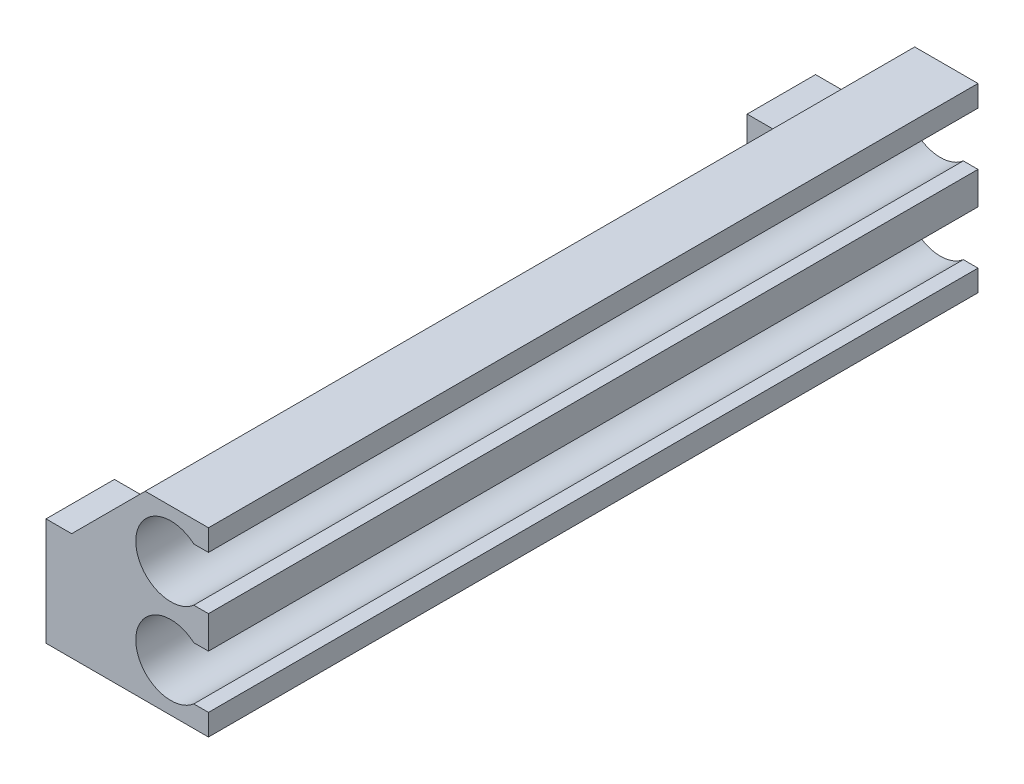
ISO-10303-21;
HEADER;
FILE_DESCRIPTION(('STEP AP214'),'2;1');
FILE_NAME('part.step','',(''),(''),'','','');
FILE_SCHEMA(('AUTOMOTIVE_DESIGN { 1 0 10303 214 1 1 1 1 }'));
ENDSEC;
DATA;
#1=APPLICATION_CONTEXT('core data for automotive mechanical design processes');
#2=APPLICATION_PROTOCOL_DEFINITION('international standard','automotive_design',2000,#1);
#3=PRODUCT_CONTEXT('',#1,'mechanical');
#4=PRODUCT('Part','Part','',(#3));
#5=PRODUCT_RELATED_PRODUCT_CATEGORY('part','',(#4));
#6=PRODUCT_DEFINITION_FORMATION('','',#4);
#7=PRODUCT_DEFINITION_CONTEXT('part definition',#1,'design');
#8=PRODUCT_DEFINITION('design','',#6,#7);
#9=PRODUCT_DEFINITION_SHAPE('','',#8);
#10=(LENGTH_UNIT() NAMED_UNIT(*) SI_UNIT(.MILLI.,.METRE.));
#11=(NAMED_UNIT(*) PLANE_ANGLE_UNIT() SI_UNIT($,.RADIAN.));
#12=(NAMED_UNIT(*) SI_UNIT($,.STERADIAN.) SOLID_ANGLE_UNIT());
#13=UNCERTAINTY_MEASURE_WITH_UNIT(LENGTH_MEASURE(1.E-05),#10,'distance_accuracy_value','');
#14=(GEOMETRIC_REPRESENTATION_CONTEXT(3) GLOBAL_UNCERTAINTY_ASSIGNED_CONTEXT((#13)) GLOBAL_UNIT_ASSIGNED_CONTEXT((#10,
#11,#12)) REPRESENTATION_CONTEXT('',''));
#15=CARTESIAN_POINT('',(0.,0.,0.));
#16=DIRECTION('',(0.,0.,1.));
#17=DIRECTION('',(1.,0.,0.));
#18=AXIS2_PLACEMENT_3D('',#15,#16,#17);
#19=CARTESIAN_POINT('',(1.50000000000002,6.3,45.));
#20=DIRECTION('',(0.,-1.,0.));
#21=DIRECTION('',(0.,0.,-1.));
#22=AXIS2_PLACEMENT_3D('',#19,#20,#21);
#23=PLANE('',#22);
#24=DIRECTION('',(-1.,0.,0.));
#25=VECTOR('',#24,1.);
#26=CARTESIAN_POINT('',(0.,6.3,4.));
#27=LINE('',#26,#25);
#28=CARTESIAN_POINT('',(0.,6.3,4.00000000000001));
#29=VERTEX_POINT('',#28);
#30=CARTESIAN_POINT('',(1.50000000000002,6.3,4.00000000000001));
#31=VERTEX_POINT('',#30);
#32=EDGE_CURVE('E94',#29,#31,#27,.F.);
#33=ORIENTED_EDGE('',*,*,#32,.T.);
#34=DIRECTION('',(0.,0.,1.));
#35=VECTOR('',#34,1.);
#36=CARTESIAN_POINT('',(1.50000000000002,6.3,45.));
#37=LINE('',#36,#35);
#38=CARTESIAN_POINT('',(1.50000000000002,6.3,0.));
#39=VERTEX_POINT('',#38);
#40=EDGE_CURVE('E262',#31,#39,#37,.F.);
#41=ORIENTED_EDGE('',*,*,#40,.T.);
#42=DIRECTION('',(1.,0.,0.));
#43=VECTOR('',#42,1.);
#44=CARTESIAN_POINT('',(1.50000000000002,6.3,0.));
#45=LINE('',#44,#43);
#46=CARTESIAN_POINT('',(0.,6.3,0.));
#47=VERTEX_POINT('',#46);
#48=EDGE_CURVE('E322',#47,#39,#45,.T.);
#49=ORIENTED_EDGE('',*,*,#48,.F.);
#50=DIRECTION('',(0.,0.,1.));
#51=VECTOR('',#50,1.);
#52=CARTESIAN_POINT('',(0.,6.3,45.));
#53=LINE('',#52,#51);
#54=EDGE_CURVE('E288',#47,#29,#53,.T.);
#55=ORIENTED_EDGE('',*,*,#54,.T.);
#56=EDGE_LOOP('',(#33,#41,#49,#55));
#57=FACE_BOUND('',#56,.T.);
#58=ADVANCED_FACE('F16',(#57),#23,.F.);
#59=CARTESIAN_POINT('',(1.50000000000002,6.3,45.));
#60=DIRECTION('',(0.,-1.,0.));
#61=DIRECTION('',(0.,0.,-1.));
#62=AXIS2_PLACEMENT_3D('',#59,#60,#61);
#63=PLANE('',#62);
#64=DIRECTION('',(1.,0.,0.));
#65=VECTOR('',#64,1.);
#66=CARTESIAN_POINT('',(0.,6.3,41.));
#67=LINE('',#66,#65);
#68=CARTESIAN_POINT('',(1.50000000000002,6.3,41.));
#69=VERTEX_POINT('',#68);
#70=CARTESIAN_POINT('',(0.,6.3,41.));
#71=VERTEX_POINT('',#70);
#72=EDGE_CURVE('E315',#69,#71,#67,.F.);
#73=ORIENTED_EDGE('',*,*,#72,.T.);
#74=DIRECTION('',(0.,0.,1.));
#75=VECTOR('',#74,1.);
#76=CARTESIAN_POINT('',(0.,6.3,45.));
#77=LINE('',#76,#75);
#78=CARTESIAN_POINT('',(0.,6.3,45.));
#79=VERTEX_POINT('',#78);
#80=EDGE_CURVE('E182',#71,#79,#77,.T.);
#81=ORIENTED_EDGE('',*,*,#80,.T.);
#82=DIRECTION('',(1.,0.,0.));
#83=VECTOR('',#82,1.);
#84=CARTESIAN_POINT('',(1.50000000000002,6.3,45.));
#85=LINE('',#84,#83);
#86=CARTESIAN_POINT('',(1.50000000000002,6.3,45.));
#87=VERTEX_POINT('',#86);
#88=EDGE_CURVE('E172',#87,#79,#85,.F.);
#89=ORIENTED_EDGE('',*,*,#88,.F.);
#90=DIRECTION('',(0.,0.,1.));
#91=VECTOR('',#90,1.);
#92=CARTESIAN_POINT('',(1.50000000000002,6.3,45.));
#93=LINE('',#92,#91);
#94=EDGE_CURVE('E256',#87,#69,#93,.F.);
#95=ORIENTED_EDGE('',*,*,#94,.T.);
#96=EDGE_LOOP('',(#73,#81,#89,#95));
#97=FACE_BOUND('',#96,.T.);
#98=ADVANCED_FACE('F381',(#97),#63,.F.);
#99=CARTESIAN_POINT('',(9.5,0.,45.));
#100=DIRECTION('',(-1.,0.,0.));
#101=DIRECTION('',(0.,0.,1.));
#102=AXIS2_PLACEMENT_3D('',#99,#100,#101);
#103=PLANE('',#102);
#104=DIRECTION('',(0.,0.,1.));
#105=VECTOR('',#104,1.);
#106=CARTESIAN_POINT('',(9.5,1.25,0.));
#107=LINE('',#106,#105);
#108=CARTESIAN_POINT('',(9.5,1.25,0.));
#109=VERTEX_POINT('',#108);
#110=CARTESIAN_POINT('',(9.5,1.25,45.));
#111=VERTEX_POINT('',#110);
#112=EDGE_CURVE('E171',#109,#111,#107,.T.);
#113=ORIENTED_EDGE('',*,*,#112,.T.);
#114=DIRECTION('',(0.,1.,0.));
#115=VECTOR('',#114,1.);
#116=CARTESIAN_POINT('',(9.5,0.,45.));
#117=LINE('',#116,#115);
#118=CARTESIAN_POINT('',(9.5,0.,45.));
#119=VERTEX_POINT('',#118);
#120=EDGE_CURVE('E85',#119,#111,#117,.T.);
#121=ORIENTED_EDGE('',*,*,#120,.F.);
#122=DIRECTION('',(0.,0.,1.));
#123=VECTOR('',#122,1.);
#124=CARTESIAN_POINT('',(9.5,0.,45.));
#125=LINE('',#124,#123);
#126=CARTESIAN_POINT('',(9.5,0.,0.));
#127=VERTEX_POINT('',#126);
#128=EDGE_CURVE('E169',#119,#127,#125,.F.);
#129=ORIENTED_EDGE('',*,*,#128,.T.);
#130=DIRECTION('',(0.,1.,0.));
#131=VECTOR('',#130,1.);
#132=CARTESIAN_POINT('',(9.5,0.,0.));
#133=LINE('',#132,#131);
#134=EDGE_CURVE('E71',#109,#127,#133,.F.);
#135=ORIENTED_EDGE('',*,*,#134,.F.);
#136=EDGE_LOOP('',(#113,#121,#129,#135));
#137=FACE_BOUND('',#136,.T.);
#138=ADVANCED_FACE('F168',(#137),#103,.F.);
#139=CARTESIAN_POINT('',(0.,10.6,4.));
#140=DIRECTION('',(0.,0.,-1.));
#141=DIRECTION('',(-1.,0.,0.));
#142=AXIS2_PLACEMENT_3D('',#139,#140,#141);
#143=PLANE('',#142);
#144=DIRECTION('',(0.,1.,0.));
#145=VECTOR('',#144,1.);
#146=CARTESIAN_POINT('',(0.,6.3,4.));
#147=LINE('',#146,#145);
#148=CARTESIAN_POINT('',(0.,0.,4.));
#149=VERTEX_POINT('',#148);
#150=EDGE_CURVE('E280',#29,#149,#147,.F.);
#151=ORIENTED_EDGE('',*,*,#150,.T.);
#152=DIRECTION('',(1.,0.,0.));
#153=VECTOR('',#152,1.);
#154=CARTESIAN_POINT('',(0.,0.,4.));
#155=LINE('',#154,#153);
#156=CARTESIAN_POINT('',(4.3,0.,4.));
#157=VERTEX_POINT('',#156);
#158=EDGE_CURVE('E240',#149,#157,#155,.T.);
#159=ORIENTED_EDGE('',*,*,#158,.T.);
#160=DIRECTION('',(0.,1.,0.));
#161=VECTOR('',#160,1.);
#162=CARTESIAN_POINT('',(4.3,10.6,4.));
#163=LINE('',#162,#161);
#164=CARTESIAN_POINT('',(4.3,9.1,4.));
#165=VERTEX_POINT('',#164);
#166=EDGE_CURVE('E317',#157,#165,#163,.T.);
#167=ORIENTED_EDGE('',*,*,#166,.T.);
#168=DIRECTION('',(0.707106781186546,0.707106781186549,0.));
#169=VECTOR('',#168,1.);
#170=CARTESIAN_POINT('',(5.8,10.6,4.));
#171=LINE('',#170,#169);
#172=EDGE_CURVE('E265',#165,#31,#171,.F.);
#173=ORIENTED_EDGE('',*,*,#172,.T.);
#174=ORIENTED_EDGE('',*,*,#32,.F.);
#175=EDGE_LOOP('',(#151,#159,#167,#173,#174));
#176=FACE_BOUND('',#175,.T.);
#177=ADVANCED_FACE('F391',(#176),#143,.F.);
#178=CARTESIAN_POINT('',(4.3,10.6,41.));
#179=DIRECTION('',(1.,0.,0.));
#180=DIRECTION('',(0.,0.,-1.));
#181=AXIS2_PLACEMENT_3D('',#178,#179,#180);
#182=PLANE('',#181);
#183=DIRECTION('',(0.,0.,1.));
#184=VECTOR('',#183,1.);
#185=CARTESIAN_POINT('',(4.3,0.,45.));
#186=LINE('',#185,#184);
#187=CARTESIAN_POINT('',(4.3,0.,41.));
#188=VERTEX_POINT('',#187);
#189=EDGE_CURVE('E237',#157,#188,#186,.T.);
#190=ORIENTED_EDGE('',*,*,#189,.T.);
#191=DIRECTION('',(0.,1.,0.));
#192=VECTOR('',#191,1.);
#193=CARTESIAN_POINT('',(4.3,10.6,41.));
#194=LINE('',#193,#192);
#195=CARTESIAN_POINT('',(4.3,9.1,41.));
#196=VERTEX_POINT('',#195);
#197=EDGE_CURVE('E311',#188,#196,#194,.T.);
#198=ORIENTED_EDGE('',*,*,#197,.T.);
#199=DIRECTION('',(0.,0.,1.));
#200=VECTOR('',#199,1.);
#201=CARTESIAN_POINT('',(4.3,9.1,45.));
#202=LINE('',#201,#200);
#203=EDGE_CURVE('E250',#196,#165,#202,.F.);
#204=ORIENTED_EDGE('',*,*,#203,.T.);
#205=ORIENTED_EDGE('',*,*,#166,.F.);
#206=EDGE_LOOP('',(#190,#198,#204,#205));
#207=FACE_BOUND('',#206,.T.);
#208=ADVANCED_FACE('F389',(#207),#182,.F.);
#209=CARTESIAN_POINT('',(0.,10.6,41.));
#210=DIRECTION('',(0.,0.,1.));
#211=DIRECTION('',(1.,0.,0.));
#212=AXIS2_PLACEMENT_3D('',#209,#210,#211);
#213=PLANE('',#212);
#214=DIRECTION('',(1.,0.,0.));
#215=VECTOR('',#214,1.);
#216=CARTESIAN_POINT('',(0.,0.,41.));
#217=LINE('',#216,#215);
#218=CARTESIAN_POINT('',(0.,0.,41.));
#219=VERTEX_POINT('',#218);
#220=EDGE_CURVE('E234',#188,#219,#217,.F.);
#221=ORIENTED_EDGE('',*,*,#220,.T.);
#222=DIRECTION('',(0.,1.,0.));
#223=VECTOR('',#222,1.);
#224=CARTESIAN_POINT('',(0.,6.3,41.));
#225=LINE('',#224,#223);
#226=EDGE_CURVE('E247',#219,#71,#225,.T.);
#227=ORIENTED_EDGE('',*,*,#226,.T.);
#228=ORIENTED_EDGE('',*,*,#72,.F.);
#229=DIRECTION('',(0.707106781186546,0.707106781186549,0.));
#230=VECTOR('',#229,1.);
#231=CARTESIAN_POINT('',(5.8,10.6,41.));
#232=LINE('',#231,#230);
#233=EDGE_CURVE('E253',#69,#196,#232,.T.);
#234=ORIENTED_EDGE('',*,*,#233,.T.);
#235=ORIENTED_EDGE('',*,*,#197,.F.);
#236=EDGE_LOOP('',(#221,#227,#228,#234,#235));
#237=FACE_BOUND('',#236,.T.);
#238=ADVANCED_FACE('F387',(#237),#213,.F.);
#239=CARTESIAN_POINT('',(8.64164078649987,4.35,0.));
#240=DIRECTION('',(0.,1.,0.));
#241=DIRECTION('',(-1.,0.,0.));
#242=AXIS2_PLACEMENT_3D('',#239,#240,#241);
#243=PLANE('',#242);
#244=DIRECTION('',(0.,0.,1.));
#245=VECTOR('',#244,1.);
#246=CARTESIAN_POINT('',(8.64164078649987,4.35,0.));
#247=LINE('',#246,#245);
#248=CARTESIAN_POINT('',(8.64164078649987,4.35,45.));
#249=VERTEX_POINT('',#248);
#250=CARTESIAN_POINT('',(8.64164078649987,4.35,0.));
#251=VERTEX_POINT('',#250);
#252=EDGE_CURVE('E229',#249,#251,#247,.F.);
#253=ORIENTED_EDGE('',*,*,#252,.T.);
#254=DIRECTION('',(-1.,0.,0.));
#255=VECTOR('',#254,1.);
#256=CARTESIAN_POINT('',(8.64164078649987,4.35,0.));
#257=LINE('',#256,#255);
#258=CARTESIAN_POINT('',(9.5,4.35,0.));
#259=VERTEX_POINT('',#258);
#260=EDGE_CURVE('E307',#259,#251,#257,.T.);
#261=ORIENTED_EDGE('',*,*,#260,.F.);
#262=DIRECTION('',(0.,0.,1.));
#263=VECTOR('',#262,1.);
#264=CARTESIAN_POINT('',(9.5,4.35,45.));
#265=LINE('',#264,#263);
#266=CARTESIAN_POINT('',(9.5,4.35,45.));
#267=VERTEX_POINT('',#266);
#268=EDGE_CURVE('E278',#259,#267,#265,.T.);
#269=ORIENTED_EDGE('',*,*,#268,.T.);
#270=DIRECTION('',(-1.,0.,0.));
#271=VECTOR('',#270,1.);
#272=CARTESIAN_POINT('',(8.64164078649987,4.35,45.));
#273=LINE('',#272,#271);
#274=EDGE_CURVE('E119',#249,#267,#273,.F.);
#275=ORIENTED_EDGE('',*,*,#274,.F.);
#276=EDGE_LOOP('',(#253,#261,#269,#275));
#277=FACE_BOUND('',#276,.T.);
#278=ADVANCED_FACE('F357',(#277),#243,.F.);
#279=CARTESIAN_POINT('',(9.5,1.25,0.));
#280=DIRECTION('',(0.,-1.,0.));
#281=DIRECTION('',(1.,0.,0.));
#282=AXIS2_PLACEMENT_3D('',#279,#280,#281);
#283=PLANE('',#282);
#284=ORIENTED_EDGE('',*,*,#112,.F.);
#285=DIRECTION('',(1.,0.,0.));
#286=VECTOR('',#285,1.);
#287=CARTESIAN_POINT('',(9.5,1.25,0.));
#288=LINE('',#287,#286);
#289=CARTESIAN_POINT('',(8.64164078649987,1.25,0.));
#290=VERTEX_POINT('',#289);
#291=EDGE_CURVE('E61',#290,#109,#288,.T.);
#292=ORIENTED_EDGE('',*,*,#291,.F.);
#293=DIRECTION('',(0.,0.,1.));
#294=VECTOR('',#293,1.);
#295=CARTESIAN_POINT('',(8.64164078649987,1.25,0.));
#296=LINE('',#295,#294);
#297=CARTESIAN_POINT('',(8.64164078649987,1.25,45.));
#298=VERTEX_POINT('',#297);
#299=EDGE_CURVE('E227',#290,#298,#296,.T.);
#300=ORIENTED_EDGE('',*,*,#299,.T.);
#301=DIRECTION('',(1.,0.,0.));
#302=VECTOR('',#301,1.);
#303=CARTESIAN_POINT('',(9.5,1.25,45.));
#304=LINE('',#303,#302);
#305=EDGE_CURVE('E297',#111,#298,#304,.F.);
#306=ORIENTED_EDGE('',*,*,#305,.F.);
#307=EDGE_LOOP('',(#284,#292,#300,#306));
#308=FACE_BOUND('',#307,.T.);
#309=ADVANCED_FACE('F439',(#308),#283,.F.);
#310=CARTESIAN_POINT('',(9.5,0.,45.));
#311=DIRECTION('',(-1.,0.,0.));
#312=DIRECTION('',(0.,0.,1.));
#313=AXIS2_PLACEMENT_3D('',#310,#311,#312);
#314=PLANE('',#313);
#315=DIRECTION('',(0.,0.,1.));
#316=VECTOR('',#315,1.);
#317=CARTESIAN_POINT('',(9.5,9.35,0.));
#318=LINE('',#317,#316);
#319=CARTESIAN_POINT('',(9.5,9.35,45.));
#320=VERTEX_POINT('',#319);
#321=CARTESIAN_POINT('',(9.5,9.35,0.));
#322=VERTEX_POINT('',#321);
#323=EDGE_CURVE('E224',#320,#322,#318,.F.);
#324=ORIENTED_EDGE('',*,*,#323,.T.);
#325=DIRECTION('',(0.,1.,0.));
#326=VECTOR('',#325,1.);
#327=CARTESIAN_POINT('',(9.5,0.,0.));
#328=LINE('',#327,#326);
#329=CARTESIAN_POINT('',(9.5,10.6,0.));
#330=VERTEX_POINT('',#329);
#331=EDGE_CURVE('E293',#330,#322,#328,.F.);
#332=ORIENTED_EDGE('',*,*,#331,.F.);
#333=DIRECTION('',(0.,0.,-1.));
#334=VECTOR('',#333,1.);
#335=CARTESIAN_POINT('',(9.5,10.6,45.));
#336=LINE('',#335,#334);
#337=CARTESIAN_POINT('',(9.5,10.6,45.));
#338=VERTEX_POINT('',#337);
#339=EDGE_CURVE('E267',#330,#338,#336,.F.);
#340=ORIENTED_EDGE('',*,*,#339,.T.);
#341=DIRECTION('',(0.,1.,0.));
#342=VECTOR('',#341,1.);
#343=CARTESIAN_POINT('',(9.5,0.,45.));
#344=LINE('',#343,#342);
#345=EDGE_CURVE('E291',#320,#338,#344,.T.);
#346=ORIENTED_EDGE('',*,*,#345,.F.);
#347=EDGE_LOOP('',(#324,#332,#340,#346));
#348=FACE_BOUND('',#347,.T.);
#349=ADVANCED_FACE('F436',(#348),#314,.F.);
#350=CARTESIAN_POINT('',(0.,6.3,45.));
#351=DIRECTION('',(1.,0.,0.));
#352=DIRECTION('',(0.,1.,0.));
#353=AXIS2_PLACEMENT_3D('',#350,#351,#352);
#354=PLANE('',#353);
#355=ORIENTED_EDGE('',*,*,#150,.F.);
#356=ORIENTED_EDGE('',*,*,#54,.F.);
#357=DIRECTION('',(0.,1.,0.));
#358=VECTOR('',#357,1.);
#359=CARTESIAN_POINT('',(0.,0.,0.));
#360=LINE('',#359,#358);
#361=CARTESIAN_POINT('',(0.,0.,0.));
#362=VERTEX_POINT('',#361);
#363=EDGE_CURVE('E215',#47,#362,#360,.F.);
#364=ORIENTED_EDGE('',*,*,#363,.T.);
#365=DIRECTION('',(0.,0.,1.));
#366=VECTOR('',#365,1.);
#367=CARTESIAN_POINT('',(0.,0.,45.));
#368=LINE('',#367,#366);
#369=EDGE_CURVE('E181',#362,#149,#368,.T.);
#370=ORIENTED_EDGE('',*,*,#369,.T.);
#371=EDGE_LOOP('',(#355,#356,#364,#370));
#372=FACE_BOUND('',#371,.T.);
#373=ADVANCED_FACE('F394',(#372),#354,.F.);
#374=CARTESIAN_POINT('',(9.5,0.,45.));
#375=DIRECTION('',(-1.,0.,0.));
#376=DIRECTION('',(0.,0.,1.));
#377=AXIS2_PLACEMENT_3D('',#374,#375,#376);
#378=PLANE('',#377);
#379=ORIENTED_EDGE('',*,*,#268,.F.);
#380=DIRECTION('',(0.,1.,0.));
#381=VECTOR('',#380,1.);
#382=CARTESIAN_POINT('',(9.5,0.,0.));
#383=LINE('',#382,#381);
#384=CARTESIAN_POINT('',(9.5,6.25,0.));
#385=VERTEX_POINT('',#384);
#386=EDGE_CURVE('E212',#259,#385,#383,.T.);
#387=ORIENTED_EDGE('',*,*,#386,.T.);
#388=DIRECTION('',(0.,0.,-1.));
#389=VECTOR('',#388,1.);
#390=CARTESIAN_POINT('',(9.5,6.25,0.));
#391=LINE('',#390,#389);
#392=CARTESIAN_POINT('',(9.5,6.25,45.));
#393=VERTEX_POINT('',#392);
#394=EDGE_CURVE('E211',#385,#393,#391,.F.);
#395=ORIENTED_EDGE('',*,*,#394,.T.);
#396=DIRECTION('',(0.,1.,0.));
#397=VECTOR('',#396,1.);
#398=CARTESIAN_POINT('',(9.5,0.,45.));
#399=LINE('',#398,#397);
#400=EDGE_CURVE('E122',#267,#393,#399,.T.);
#401=ORIENTED_EDGE('',*,*,#400,.F.);
#402=EDGE_LOOP('',(#379,#387,#395,#401));
#403=FACE_BOUND('',#402,.T.);
#404=ADVANCED_FACE('F359',(#403),#378,.F.);
#405=CARTESIAN_POINT('',(9.5,10.6,45.));
#406=DIRECTION('',(0.,-1.,0.));
#407=DIRECTION('',(0.,0.,-1.));
#408=AXIS2_PLACEMENT_3D('',#405,#406,#407);
#409=PLANE('',#408);
#410=DIRECTION('',(0.,0.,1.));
#411=VECTOR('',#410,1.);
#412=CARTESIAN_POINT('',(5.8,10.6,45.));
#413=LINE('',#412,#411);
#414=CARTESIAN_POINT('',(5.8,10.6,0.));
#415=VERTEX_POINT('',#414);
#416=CARTESIAN_POINT('',(5.8,10.6,45.));
#417=VERTEX_POINT('',#416);
#418=EDGE_CURVE('E259',#415,#417,#413,.T.);
#419=ORIENTED_EDGE('',*,*,#418,.T.);
#420=DIRECTION('',(1.,0.,0.));
#421=VECTOR('',#420,1.);
#422=CARTESIAN_POINT('',(0.,10.6,45.));
#423=LINE('',#422,#421);
#424=EDGE_CURVE('E328',#338,#417,#423,.F.);
#425=ORIENTED_EDGE('',*,*,#424,.F.);
#426=ORIENTED_EDGE('',*,*,#339,.F.);
#427=DIRECTION('',(1.,0.,0.));
#428=VECTOR('',#427,1.);
#429=CARTESIAN_POINT('',(0.,10.6,0.));
#430=LINE('',#429,#428);
#431=EDGE_CURVE('E221',#330,#415,#430,.F.);
#432=ORIENTED_EDGE('',*,*,#431,.T.);
#433=EDGE_LOOP('',(#419,#425,#426,#432));
#434=FACE_BOUND('',#433,.T.);
#435=ADVANCED_FACE('F428',(#434),#409,.F.);
#436=CARTESIAN_POINT('',(5.8,10.6,45.));
#437=DIRECTION('',(0.707106781186549,-0.707106781186546,0.));
#438=DIRECTION('',(0.707106781186546,0.707106781186549,0.));
#439=AXIS2_PLACEMENT_3D('',#436,#437,#438);
#440=PLANE('',#439);
#441=ORIENTED_EDGE('',*,*,#233,.F.);
#442=ORIENTED_EDGE('',*,*,#94,.F.);
#443=DIRECTION('',(-0.707106781186546,-0.707106781186549,0.));
#444=VECTOR('',#443,1.);
#445=CARTESIAN_POINT('',(5.8,10.6,45.));
#446=LINE('',#445,#444);
#447=EDGE_CURVE('E188',#417,#87,#446,.T.);
#448=ORIENTED_EDGE('',*,*,#447,.F.);
#449=ORIENTED_EDGE('',*,*,#418,.F.);
#450=DIRECTION('',(-0.707106781186546,-0.707106781186549,0.));
#451=VECTOR('',#450,1.);
#452=CARTESIAN_POINT('',(5.8,10.6,0.));
#453=LINE('',#452,#451);
#454=EDGE_CURVE('E218',#415,#39,#453,.T.);
#455=ORIENTED_EDGE('',*,*,#454,.T.);
#456=ORIENTED_EDGE('',*,*,#40,.F.);
#457=ORIENTED_EDGE('',*,*,#172,.F.);
#458=ORIENTED_EDGE('',*,*,#203,.F.);
#459=EDGE_LOOP('',(#441,#442,#448,#449,#455,#456,#457,#458));
#460=FACE_BOUND('',#459,.T.);
#461=ADVANCED_FACE('F377',(#460),#440,.F.);
#462=CARTESIAN_POINT('',(0.,6.3,45.));
#463=DIRECTION('',(1.,0.,0.));
#464=DIRECTION('',(0.,1.,0.));
#465=AXIS2_PLACEMENT_3D('',#462,#463,#464);
#466=PLANE('',#465);
#467=ORIENTED_EDGE('',*,*,#226,.F.);
#468=DIRECTION('',(0.,0.,1.));
#469=VECTOR('',#468,1.);
#470=CARTESIAN_POINT('',(0.,0.,45.));
#471=LINE('',#470,#469);
#472=CARTESIAN_POINT('',(0.,0.,45.));
#473=VERTEX_POINT('',#472);
#474=EDGE_CURVE('E232',#219,#473,#471,.T.);
#475=ORIENTED_EDGE('',*,*,#474,.T.);
#476=DIRECTION('',(0.,1.,0.));
#477=VECTOR('',#476,1.);
#478=CARTESIAN_POINT('',(0.,0.,45.));
#479=LINE('',#478,#477);
#480=EDGE_CURVE('E163',#79,#473,#479,.F.);
#481=ORIENTED_EDGE('',*,*,#480,.F.);
#482=ORIENTED_EDGE('',*,*,#80,.F.);
#483=EDGE_LOOP('',(#467,#475,#481,#482));
#484=FACE_BOUND('',#483,.T.);
#485=ADVANCED_FACE('F384',(#484),#466,.F.);
#486=CARTESIAN_POINT('',(0.,0.,45.));
#487=DIRECTION('',(0.,1.,0.));
#488=DIRECTION('',(0.,0.,1.));
#489=AXIS2_PLACEMENT_3D('',#486,#487,#488);
#490=PLANE('',#489);
#491=ORIENTED_EDGE('',*,*,#220,.F.);
#492=ORIENTED_EDGE('',*,*,#189,.F.);
#493=ORIENTED_EDGE('',*,*,#158,.F.);
#494=ORIENTED_EDGE('',*,*,#369,.F.);
#495=DIRECTION('',(1.,0.,0.));
#496=VECTOR('',#495,1.);
#497=CARTESIAN_POINT('',(0.,0.,0.));
#498=LINE('',#497,#496);
#499=EDGE_CURVE('E180',#362,#127,#498,.T.);
#500=ORIENTED_EDGE('',*,*,#499,.T.);
#501=ORIENTED_EDGE('',*,*,#128,.F.);
#502=DIRECTION('',(1.,0.,0.));
#503=VECTOR('',#502,1.);
#504=CARTESIAN_POINT('',(0.,0.,45.));
#505=LINE('',#504,#503);
#506=EDGE_CURVE('E179',#473,#119,#505,.T.);
#507=ORIENTED_EDGE('',*,*,#506,.F.);
#508=ORIENTED_EDGE('',*,*,#474,.F.);
#509=EDGE_LOOP('',(#491,#492,#493,#494,#500,#501,#507,#508));
#510=FACE_BOUND('',#509,.T.);
#511=ADVANCED_FACE('F177',(#510),#490,.F.);
#512=CARTESIAN_POINT('',(7.3,2.8,0.));
#513=DIRECTION('',(0.,0.,1.));
#514=DIRECTION('',(1.,0.,0.));
#515=AXIS2_PLACEMENT_3D('',#512,#513,#514);
#516=CYLINDRICAL_SURFACE('',#515,2.05);
#517=ORIENTED_EDGE('',*,*,#299,.F.);
#518=CARTESIAN_POINT('',(7.3,2.8,0.));
#519=DIRECTION('',(0.,0.,1.));
#520=DIRECTION('',(1.,0.,0.));
#521=AXIS2_PLACEMENT_3D('',#518,#519,#520);
#522=CIRCLE('',#521,2.05);
#523=EDGE_CURVE('E19',#290,#251,#522,.F.);
#524=ORIENTED_EDGE('',*,*,#523,.T.);
#525=ORIENTED_EDGE('',*,*,#252,.F.);
#526=CARTESIAN_POINT('',(7.3,2.8,45.));
#527=DIRECTION('',(0.,0.,1.));
#528=DIRECTION('',(1.,0.,0.));
#529=AXIS2_PLACEMENT_3D('',#526,#527,#528);
#530=CIRCLE('',#529,2.05);
#531=EDGE_CURVE('E185',#298,#249,#530,.F.);
#532=ORIENTED_EDGE('',*,*,#531,.F.);
#533=EDGE_LOOP('',(#517,#524,#525,#532));
#534=FACE_BOUND('',#533,.T.);
#535=ADVANCED_FACE('F350',(#534),#516,.F.);
#536=CARTESIAN_POINT('',(9.5,9.35,0.));
#537=DIRECTION('',(0.,1.,0.));
#538=DIRECTION('',(-1.,0.,0.));
#539=AXIS2_PLACEMENT_3D('',#536,#537,#538);
#540=PLANE('',#539);
#541=DIRECTION('',(0.,0.,1.));
#542=VECTOR('',#541,1.);
#543=CARTESIAN_POINT('',(8.64164078649987,9.35,0.));
#544=LINE('',#543,#542);
#545=CARTESIAN_POINT('',(8.64164078649987,9.35,45.));
#546=VERTEX_POINT('',#545);
#547=CARTESIAN_POINT('',(8.64164078649987,9.35,0.));
#548=VERTEX_POINT('',#547);
#549=EDGE_CURVE('E187',#546,#548,#544,.F.);
#550=ORIENTED_EDGE('',*,*,#549,.T.);
#551=DIRECTION('',(1.,0.,0.));
#552=VECTOR('',#551,1.);
#553=CARTESIAN_POINT('',(0.,9.35,0.));
#554=LINE('',#553,#552);
#555=EDGE_CURVE('E222',#548,#322,#554,.T.);
#556=ORIENTED_EDGE('',*,*,#555,.T.);
#557=ORIENTED_EDGE('',*,*,#323,.F.);
#558=DIRECTION('',(1.,0.,0.));
#559=VECTOR('',#558,1.);
#560=CARTESIAN_POINT('',(0.,9.35,45.));
#561=LINE('',#560,#559);
#562=EDGE_CURVE('E330',#546,#320,#561,.T.);
#563=ORIENTED_EDGE('',*,*,#562,.F.);
#564=EDGE_LOOP('',(#550,#556,#557,#563));
#565=FACE_BOUND('',#564,.T.);
#566=ADVANCED_FACE('F417',(#565),#540,.F.);
#567=CARTESIAN_POINT('',(0.,0.,0.));
#568=DIRECTION('',(0.,0.,1.));
#569=DIRECTION('',(1.,0.,0.));
#570=AXIS2_PLACEMENT_3D('',#567,#568,#569);
#571=PLANE('',#570);
#572=ORIENTED_EDGE('',*,*,#260,.T.);
#573=ORIENTED_EDGE('',*,*,#523,.F.);
#574=ORIENTED_EDGE('',*,*,#291,.T.);
#575=ORIENTED_EDGE('',*,*,#134,.T.);
#576=ORIENTED_EDGE('',*,*,#499,.F.);
#577=ORIENTED_EDGE('',*,*,#363,.F.);
#578=ORIENTED_EDGE('',*,*,#48,.T.);
#579=ORIENTED_EDGE('',*,*,#454,.F.);
#580=ORIENTED_EDGE('',*,*,#431,.F.);
#581=ORIENTED_EDGE('',*,*,#331,.T.);
#582=ORIENTED_EDGE('',*,*,#555,.F.);
#583=CARTESIAN_POINT('',(7.3,7.8,0.));
#584=DIRECTION('',(0.,0.,1.));
#585=DIRECTION('',(1.,0.,0.));
#586=AXIS2_PLACEMENT_3D('',#583,#584,#585);
#587=CIRCLE('',#586,2.05);
#588=CARTESIAN_POINT('',(8.64164078649987,6.25,0.));
#589=VERTEX_POINT('',#588);
#590=EDGE_CURVE('E196',#548,#589,#587,.T.);
#591=ORIENTED_EDGE('',*,*,#590,.T.);
#592=DIRECTION('',(1.,0.,0.));
#593=VECTOR('',#592,1.);
#594=CARTESIAN_POINT('',(8.64164078649987,6.25,0.));
#595=LINE('',#594,#593);
#596=EDGE_CURVE('E209',#589,#385,#595,.T.);
#597=ORIENTED_EDGE('',*,*,#596,.T.);
#598=ORIENTED_EDGE('',*,*,#386,.F.);
#599=EDGE_LOOP('',(#572,#573,#574,#575,#576,#577,#578,#579,#580,#581,#582,#591,#597,#598));
#600=FACE_BOUND('',#599,.T.);
#601=ADVANCED_FACE('F352',(#600),#571,.F.);
#602=CARTESIAN_POINT('',(8.64164078649987,6.25,0.));
#603=DIRECTION('',(0.,-1.,0.));
#604=DIRECTION('',(0.,0.,-1.));
#605=AXIS2_PLACEMENT_3D('',#602,#603,#604);
#606=PLANE('',#605);
#607=ORIENTED_EDGE('',*,*,#394,.F.);
#608=ORIENTED_EDGE('',*,*,#596,.F.);
#609=DIRECTION('',(0.,0.,1.));
#610=VECTOR('',#609,1.);
#611=CARTESIAN_POINT('',(8.64164078649987,6.25,0.));
#612=LINE('',#611,#610);
#613=CARTESIAN_POINT('',(8.64164078649987,6.25,45.));
#614=VERTEX_POINT('',#613);
#615=EDGE_CURVE('E25',#589,#614,#612,.T.);
#616=ORIENTED_EDGE('',*,*,#615,.T.);
#617=DIRECTION('',(1.,0.,0.));
#618=VECTOR('',#617,1.);
#619=CARTESIAN_POINT('',(0.,6.25,45.));
#620=LINE('',#619,#618);
#621=EDGE_CURVE('E33',#393,#614,#620,.F.);
#622=ORIENTED_EDGE('',*,*,#621,.F.);
#623=EDGE_LOOP('',(#607,#608,#616,#622));
#624=FACE_BOUND('',#623,.T.);
#625=ADVANCED_FACE('F362',(#624),#606,.F.);
#626=CARTESIAN_POINT('',(0.,0.,45.));
#627=DIRECTION('',(0.,0.,1.));
#628=DIRECTION('',(1.,0.,0.));
#629=AXIS2_PLACEMENT_3D('',#626,#627,#628);
#630=PLANE('',#629);
#631=ORIENTED_EDGE('',*,*,#305,.T.);
#632=ORIENTED_EDGE('',*,*,#531,.T.);
#633=ORIENTED_EDGE('',*,*,#274,.T.);
#634=ORIENTED_EDGE('',*,*,#400,.T.);
#635=ORIENTED_EDGE('',*,*,#621,.T.);
#636=CARTESIAN_POINT('',(7.3,7.8,45.));
#637=DIRECTION('',(0.,0.,1.));
#638=DIRECTION('',(1.,0.,0.));
#639=AXIS2_PLACEMENT_3D('',#636,#637,#638);
#640=CIRCLE('',#639,2.05);
#641=EDGE_CURVE('E11',#614,#546,#640,.F.);
#642=ORIENTED_EDGE('',*,*,#641,.T.);
#643=ORIENTED_EDGE('',*,*,#562,.T.);
#644=ORIENTED_EDGE('',*,*,#345,.T.);
#645=ORIENTED_EDGE('',*,*,#424,.T.);
#646=ORIENTED_EDGE('',*,*,#447,.T.);
#647=ORIENTED_EDGE('',*,*,#88,.T.);
#648=ORIENTED_EDGE('',*,*,#480,.T.);
#649=ORIENTED_EDGE('',*,*,#506,.T.);
#650=ORIENTED_EDGE('',*,*,#120,.T.);
#651=EDGE_LOOP('',(#631,#632,#633,#634,#635,#642,#643,#644,#645,#646,#647,#648,#649,#650));
#652=FACE_BOUND('',#651,.T.);
#653=ADVANCED_FACE('F184',(#652),#630,.T.);
#654=CARTESIAN_POINT('',(7.3,7.8,0.));
#655=DIRECTION('',(0.,0.,1.));
#656=DIRECTION('',(1.,0.,0.));
#657=AXIS2_PLACEMENT_3D('',#654,#655,#656);
#658=CYLINDRICAL_SURFACE('',#657,2.05);
#659=ORIENTED_EDGE('',*,*,#615,.F.);
#660=ORIENTED_EDGE('',*,*,#590,.F.);
#661=ORIENTED_EDGE('',*,*,#549,.F.);
#662=ORIENTED_EDGE('',*,*,#641,.F.);
#663=EDGE_LOOP('',(#659,#660,#661,#662));
#664=FACE_BOUND('',#663,.T.);
#665=ADVANCED_FACE('F404',(#664),#658,.F.);
#666=CLOSED_SHELL('',(#58,#98,#138,#177,#208,#238,#278,#309,#349,#373,#404,#435,#461,#485,#511,
#535,#566,#601,#625,#653,#665));
#667=MANIFOLD_SOLID_BREP('B1',#666);
#668=ADVANCED_BREP_SHAPE_REPRESENTATION('',(#18,#667),#14);
#669=SHAPE_DEFINITION_REPRESENTATION(#9,#668);
ENDSEC;
END-ISO-10303-21;
